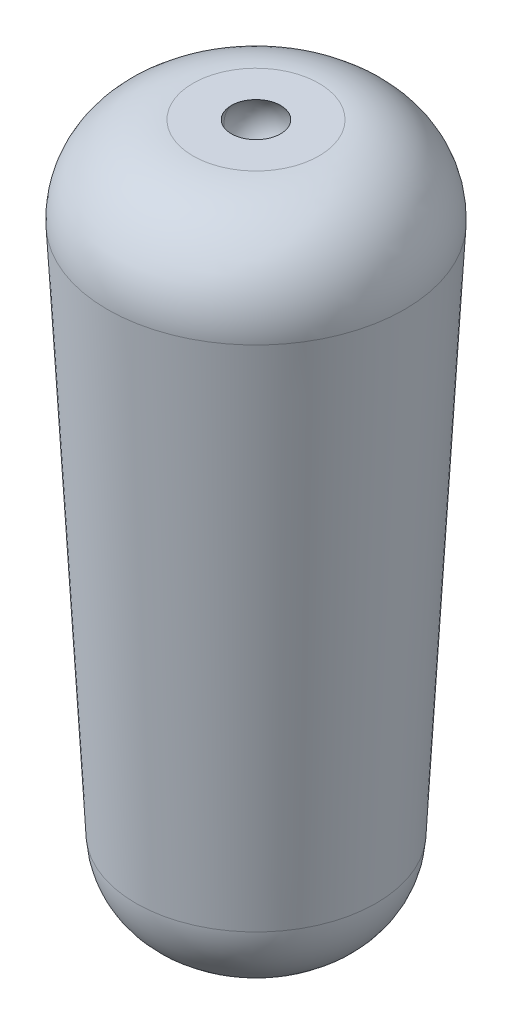
ISO-10303-21;
HEADER;
FILE_DESCRIPTION(('STEP AP214'),'2;1');
FILE_NAME('part.step','',(''),(''),'','','');
FILE_SCHEMA(('AUTOMOTIVE_DESIGN { 1 0 10303 214 1 1 1 1 }'));
ENDSEC;
DATA;
#1=APPLICATION_CONTEXT('core data for automotive mechanical design processes');
#2=APPLICATION_PROTOCOL_DEFINITION('international standard','automotive_design',2000,#1);
#3=PRODUCT_CONTEXT('',#1,'mechanical');
#4=PRODUCT('Part','Part','',(#3));
#5=PRODUCT_RELATED_PRODUCT_CATEGORY('part','',(#4));
#6=PRODUCT_DEFINITION_FORMATION('','',#4);
#7=PRODUCT_DEFINITION_CONTEXT('part definition',#1,'design');
#8=PRODUCT_DEFINITION('design','',#6,#7);
#9=PRODUCT_DEFINITION_SHAPE('','',#8);
#10=(LENGTH_UNIT() NAMED_UNIT(*) SI_UNIT(.MILLI.,.METRE.));
#11=(NAMED_UNIT(*) PLANE_ANGLE_UNIT() SI_UNIT($,.RADIAN.));
#12=(NAMED_UNIT(*) SI_UNIT($,.STERADIAN.) SOLID_ANGLE_UNIT());
#13=UNCERTAINTY_MEASURE_WITH_UNIT(LENGTH_MEASURE(1.E-05),#10,'distance_accuracy_value','');
#14=(GEOMETRIC_REPRESENTATION_CONTEXT(3) GLOBAL_UNCERTAINTY_ASSIGNED_CONTEXT((#13)) GLOBAL_UNIT_ASSIGNED_CONTEXT((#10,
#11,#12)) REPRESENTATION_CONTEXT('',''));
#15=CARTESIAN_POINT('',(0.,0.,0.));
#16=DIRECTION('',(0.,0.,1.));
#17=DIRECTION('',(1.,0.,0.));
#18=AXIS2_PLACEMENT_3D('',#15,#16,#17);
#19=CARTESIAN_POINT('',(0.,-415.,0.));
#20=DIRECTION('',(0.,1.,0.));
#21=DIRECTION('',(0.,0.,1.));
#22=AXIS2_PLACEMENT_3D('',#19,#20,#21);
#23=PLANE('',#22);
#24=CARTESIAN_POINT('',(0.,-415.,0.));
#25=DIRECTION('',(0.,-1.,0.));
#26=DIRECTION('',(0.,0.,-1.));
#27=AXIS2_PLACEMENT_3D('',#24,#25,#26);
#28=CIRCLE('',#27,19.05);
#29=CARTESIAN_POINT('',(0.,-415.,-19.05));
#30=VERTEX_POINT('',#29);
#31=EDGE_CURVE('E107',#30,#30,#28,.T.);
#32=ORIENTED_EDGE('',*,*,#31,.F.);
#33=EDGE_LOOP('',(#32));
#34=FACE_BOUND('',#33,.T.);
#35=CARTESIAN_POINT('',(0.,-415.,0.));
#36=DIRECTION('',(0.,1.,0.));
#37=DIRECTION('',(0.,0.,1.));
#38=AXIS2_PLACEMENT_3D('',#35,#36,#37);
#39=CIRCLE('',#38,20.5724355055544);
#40=CARTESIAN_POINT('',(0.,-415.,20.5724355055544));
#41=VERTEX_POINT('',#40);
#42=EDGE_CURVE('E94',#41,#41,#39,.F.);
#43=ORIENTED_EDGE('',*,*,#42,.T.);
#44=EDGE_LOOP('',(#43));
#45=FACE_BOUND('',#44,.T.);
#46=ADVANCED_FACE('F57',(#34,#45),#23,.F.);
#47=CARTESIAN_POINT('',(0.,0.,0.));
#48=DIRECTION('',(0.,1.,0.));
#49=DIRECTION('',(0.,0.,1.));
#50=AXIS2_PLACEMENT_3D('',#47,#48,#49);
#51=PLANE('',#50);
#52=CARTESIAN_POINT('',(0.,0.,0.));
#53=DIRECTION('',(0.,1.,0.));
#54=DIRECTION('',(0.,0.,1.));
#55=AXIS2_PLACEMENT_3D('',#52,#53,#54);
#56=CIRCLE('',#55,14.596117832185);
#57=CARTESIAN_POINT('',(-14.596117832185,0.,0.));
#58=VERTEX_POINT('',#57);
#59=CARTESIAN_POINT('',(14.596117832185,0.,0.));
#60=VERTEX_POINT('',#59);
#61=EDGE_CURVE('E11',#58,#60,#56,.T.);
#62=ORIENTED_EDGE('',*,*,#61,.F.);
#63=CARTESIAN_POINT('',(0.,0.,0.));
#64=DIRECTION('',(0.,1.,0.));
#65=DIRECTION('',(0.,0.,1.));
#66=AXIS2_PLACEMENT_3D('',#63,#64,#65);
#67=CIRCLE('',#66,14.596117832185);
#68=EDGE_CURVE('E66',#60,#58,#67,.T.);
#69=ORIENTED_EDGE('',*,*,#68,.F.);
#70=EDGE_LOOP('',(#62,#69));
#71=FACE_BOUND('',#70,.T.);
#72=CARTESIAN_POINT('',(0.,0.,0.));
#73=DIRECTION('',(0.,1.,0.));
#74=DIRECTION('',(0.,0.,1.));
#75=AXIS2_PLACEMENT_3D('',#72,#73,#74);
#76=CIRCLE('',#75,37.3632089993009);
#77=CARTESIAN_POINT('',(0.,0.,37.3632089993009));
#78=VERTEX_POINT('',#77);
#79=EDGE_CURVE('E78',#78,#78,#76,.T.);
#80=ORIENTED_EDGE('',*,*,#79,.T.);
#81=EDGE_LOOP('',(#80));
#82=FACE_BOUND('',#81,.T.);
#83=ADVANCED_FACE('F85',(#71,#82),#51,.T.);
#84=CARTESIAN_POINT('',(0.,-415.,0.));
#85=DIRECTION('',(0.,1.,0.));
#86=DIRECTION('',(0.,0.,1.));
#87=AXIS2_PLACEMENT_3D('',#84,#85,#86);
#88=CONICAL_SURFACE('',#87,68.7236218590137,0.0535250020953335);
#89=CARTESIAN_POINT('',(0.,-366.917771970038,0.));
#90=DIRECTION('',(0.,1.,0.));
#91=DIRECTION('',(0.,0.,1.));
#92=AXIS2_PLACEMENT_3D('',#89,#90,#91);
#93=CIRCLE('',#92,71.2996837604999);
#94=CARTESIAN_POINT('',(0.,-366.917771970038,71.2996837604999));
#95=VERTEX_POINT('',#94);
#96=EDGE_CURVE('E98',#95,#95,#93,.T.);
#97=ORIENTED_EDGE('',*,*,#96,.T.);
#98=EDGE_LOOP('',(#97));
#99=FACE_BOUND('',#98,.T.);
#100=CARTESIAN_POINT('',(0.,-53.5177719700377,0.));
#101=DIRECTION('',(0.,-1.,0.));
#102=DIRECTION('',(0.,0.,-1.));
#103=AXIS2_PLACEMENT_3D('',#100,#101,#102);
#104=CIRCLE('',#103,88.0904572542465);
#105=CARTESIAN_POINT('',(0.,-53.5177719700377,-88.0904572542465));
#106=VERTEX_POINT('',#105);
#107=EDGE_CURVE('E82',#106,#106,#104,.T.);
#108=ORIENTED_EDGE('',*,*,#107,.T.);
#109=EDGE_LOOP('',(#108));
#110=FACE_BOUND('',#109,.T.);
#111=ADVANCED_FACE('F88',(#99,#110),#88,.T.);
#112=CARTESIAN_POINT('',(0.,-364.2,0.));
#113=DIRECTION('',(0.,1.,0.));
#114=DIRECTION('',(0.,0.,1.));
#115=AXIS2_PLACEMENT_3D('',#112,#113,#114);
#116=DEGENERATE_TOROIDAL_SURFACE('',#115,20.5724355055544,50.8,.T.);
#117=ORIENTED_EDGE('',*,*,#42,.F.);
#118=EDGE_LOOP('',(#117));
#119=FACE_BOUND('',#118,.T.);
#120=ORIENTED_EDGE('',*,*,#96,.F.);
#121=EDGE_LOOP('',(#120));
#122=FACE_BOUND('',#121,.T.);
#123=ADVANCED_FACE('F128',(#119,#122),#116,.T.);
#124=CARTESIAN_POINT('',(0.,-50.8,0.));
#125=DIRECTION('',(0.,1.,0.));
#126=DIRECTION('',(0.,0.,1.));
#127=AXIS2_PLACEMENT_3D('',#124,#125,#126);
#128=DEGENERATE_TOROIDAL_SURFACE('',#127,37.3632089993009,50.8,.T.);
#129=ORIENTED_EDGE('',*,*,#107,.F.);
#130=EDGE_LOOP('',(#129));
#131=FACE_BOUND('',#130,.T.);
#132=ORIENTED_EDGE('',*,*,#79,.F.);
#133=EDGE_LOOP('',(#132));
#134=FACE_BOUND('',#133,.T.);
#135=ADVANCED_FACE('F59',(#131,#134),#128,.T.);
#136=CARTESIAN_POINT('',(0.,-12.2415621645676,0.));
#137=DIRECTION('',(0.,0.,1.));
#138=DIRECTION('',(1.,0.,0.));
#139=AXIS2_PLACEMENT_3D('',#136,#137,#138);
#140=SPHERICAL_SURFACE('',#139,19.05);
#141=ORIENTED_EDGE('',*,*,#61,.T.);
#142=CARTESIAN_POINT('',(0.,-12.2415621645676,0.));
#143=DIRECTION('',(0.,0.,-1.));
#144=DIRECTION('',(-1.,0.,0.));
#145=AXIS2_PLACEMENT_3D('',#142,#143,#144);
#146=CIRCLE('',#145,19.05);
#147=EDGE_CURVE('E72',#60,#58,#146,.T.);
#148=ORIENTED_EDGE('',*,*,#147,.T.);
#149=EDGE_LOOP('',(#141,#148));
#150=FACE_BOUND('',#149,.T.);
#151=ADVANCED_FACE('F80',(#150),#140,.F.);
#152=CARTESIAN_POINT('',(0.,-12.2415621645676,0.));
#153=DIRECTION('',(0.,0.,1.));
#154=DIRECTION('',(1.,0.,0.));
#155=AXIS2_PLACEMENT_3D('',#152,#153,#154);
#156=SPHERICAL_SURFACE('',#155,19.05);
#157=ORIENTED_EDGE('',*,*,#68,.T.);
#158=ORIENTED_EDGE('',*,*,#147,.F.);
#159=EDGE_LOOP('',(#157,#158));
#160=FACE_BOUND('',#159,.T.);
#161=ADVANCED_FACE('F74',(#160),#156,.F.);
#162=CARTESIAN_POINT('',(0.,-412.46,0.));
#163=DIRECTION('',(0.,-1.,0.));
#164=DIRECTION('',(0.,0.,-1.));
#165=AXIS2_PLACEMENT_3D('',#162,#163,#164);
#166=CYLINDRICAL_SURFACE('',#165,19.05);
#167=CARTESIAN_POINT('',(0.,-412.46,0.));
#168=DIRECTION('',(0.,-1.,0.));
#169=DIRECTION('',(0.,0.,-1.));
#170=AXIS2_PLACEMENT_3D('',#167,#168,#169);
#171=CIRCLE('',#170,19.05);
#172=CARTESIAN_POINT('',(0.,-412.46,-19.05));
#173=VERTEX_POINT('',#172);
#174=EDGE_CURVE('E83',#173,#173,#171,.T.);
#175=ORIENTED_EDGE('',*,*,#174,.F.);
#176=EDGE_LOOP('',(#175));
#177=FACE_BOUND('',#176,.T.);
#178=ORIENTED_EDGE('',*,*,#31,.T.);
#179=EDGE_LOOP('',(#178));
#180=FACE_BOUND('',#179,.T.);
#181=ADVANCED_FACE('F117',(#177,#180),#166,.F.);
#182=CARTESIAN_POINT('',(0.,-412.46,0.));
#183=DIRECTION('',(0.,-1.,0.));
#184=DIRECTION('',(0.,0.,-1.));
#185=AXIS2_PLACEMENT_3D('',#182,#183,#184);
#186=PLANE('',#185);
#187=ORIENTED_EDGE('',*,*,#174,.T.);
#188=EDGE_LOOP('',(#187));
#189=FACE_BOUND('',#188,.T.);
#190=ADVANCED_FACE('F115',(#189),#186,.T.);
#191=CLOSED_SHELL('',(#46,#83,#111,#123,#135,#151,#161,#181,#190));
#192=MANIFOLD_SOLID_BREP('B2',#191);
#193=ADVANCED_BREP_SHAPE_REPRESENTATION('',(#18,#192),#14);
#194=SHAPE_DEFINITION_REPRESENTATION(#9,#193);
ENDSEC;
END-ISO-10303-21;
